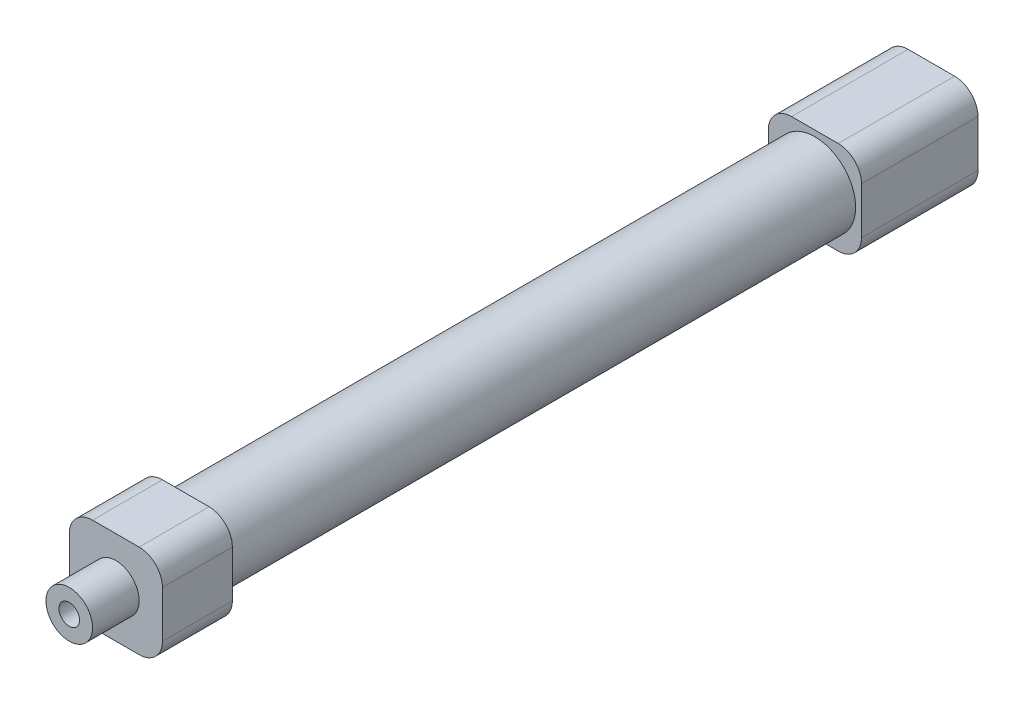
ISO-10303-21;
HEADER;
FILE_DESCRIPTION(('STEP AP214'),'2;1');
FILE_NAME('part.step','',(''),(''),'','','');
FILE_SCHEMA(('AUTOMOTIVE_DESIGN { 1 0 10303 214 1 1 1 1 }'));
ENDSEC;
DATA;
#1=APPLICATION_CONTEXT('core data for automotive mechanical design processes');
#2=APPLICATION_PROTOCOL_DEFINITION('international standard','automotive_design',2000,#1);
#3=PRODUCT_CONTEXT('',#1,'mechanical');
#4=PRODUCT('Part','Part','',(#3));
#5=PRODUCT_RELATED_PRODUCT_CATEGORY('part','',(#4));
#6=PRODUCT_DEFINITION_FORMATION('','',#4);
#7=PRODUCT_DEFINITION_CONTEXT('part definition',#1,'design');
#8=PRODUCT_DEFINITION('design','',#6,#7);
#9=PRODUCT_DEFINITION_SHAPE('','',#8);
#10=(LENGTH_UNIT() NAMED_UNIT(*) SI_UNIT(.MILLI.,.METRE.));
#11=(NAMED_UNIT(*) PLANE_ANGLE_UNIT() SI_UNIT($,.RADIAN.));
#12=(NAMED_UNIT(*) SI_UNIT($,.STERADIAN.) SOLID_ANGLE_UNIT());
#13=UNCERTAINTY_MEASURE_WITH_UNIT(LENGTH_MEASURE(1.E-05),#10,'distance_accuracy_value','');
#14=(GEOMETRIC_REPRESENTATION_CONTEXT(3) GLOBAL_UNCERTAINTY_ASSIGNED_CONTEXT((#13)) GLOBAL_UNIT_ASSIGNED_CONTEXT((#10,
#11,#12)) REPRESENTATION_CONTEXT('',''));
#15=CARTESIAN_POINT('',(0.,0.,0.));
#16=DIRECTION('',(0.,0.,1.));
#17=DIRECTION('',(1.,0.,0.));
#18=AXIS2_PLACEMENT_3D('',#15,#16,#17);
#19=CARTESIAN_POINT('',(0.,0.,175.));
#20=DIRECTION('',(0.,0.,-1.));
#21=DIRECTION('',(-1.,0.,0.));
#22=AXIS2_PLACEMENT_3D('',#19,#20,#21);
#23=CYLINDRICAL_SURFACE('',#22,8.75);
#24=CARTESIAN_POINT('',(0.,0.,25.));
#25=DIRECTION('',(0.,0.,-1.));
#26=DIRECTION('',(-1.,0.,0.));
#27=AXIS2_PLACEMENT_3D('',#24,#25,#26);
#28=CIRCLE('',#27,8.75);
#29=CARTESIAN_POINT('',(-8.75,0.,25.));
#30=VERTEX_POINT('',#29);
#31=EDGE_CURVE('E196',#30,#30,#28,.T.);
#32=ORIENTED_EDGE('',*,*,#31,.F.);
#33=EDGE_LOOP('',(#32));
#34=FACE_BOUND('',#33,.T.);
#35=CARTESIAN_POINT('',(0.,0.,160.));
#36=DIRECTION('',(0.,0.,1.));
#37=DIRECTION('',(1.,0.,0.));
#38=AXIS2_PLACEMENT_3D('',#35,#36,#37);
#39=CIRCLE('',#38,8.75);
#40=CARTESIAN_POINT('',(8.75,0.,160.));
#41=VERTEX_POINT('',#40);
#42=EDGE_CURVE('E190',#41,#41,#39,.T.);
#43=ORIENTED_EDGE('',*,*,#42,.F.);
#44=EDGE_LOOP('',(#43));
#45=FACE_BOUND('',#44,.T.);
#46=ADVANCED_FACE('F45',(#34,#45),#23,.T.);
#47=CARTESIAN_POINT('',(9.99999999999999,-10.,25.));
#48=DIRECTION('',(-1.,0.,0.));
#49=DIRECTION('',(0.,0.,1.));
#50=AXIS2_PLACEMENT_3D('',#47,#48,#49);
#51=PLANE('',#50);
#52=DIRECTION('',(0.,1.,0.));
#53=VECTOR('',#52,1.);
#54=CARTESIAN_POINT('',(9.99999999999999,-10.,25.));
#55=LINE('',#54,#53);
#56=CARTESIAN_POINT('',(9.99999999999999,-5.,25.));
#57=VERTEX_POINT('',#56);
#58=CARTESIAN_POINT('',(9.99999999999999,5.,25.));
#59=VERTEX_POINT('',#58);
#60=EDGE_CURVE('E314',#57,#59,#55,.T.);
#61=ORIENTED_EDGE('',*,*,#60,.F.);
#62=DIRECTION('',(0.,0.,-1.));
#63=VECTOR('',#62,1.);
#64=CARTESIAN_POINT('',(9.99999999999999,-5.,25.));
#65=LINE('',#64,#63);
#66=CARTESIAN_POINT('',(9.99999999999999,-5.,0.));
#67=VERTEX_POINT('',#66);
#68=EDGE_CURVE('E243',#57,#67,#65,.T.);
#69=ORIENTED_EDGE('',*,*,#68,.T.);
#70=DIRECTION('',(0.,1.,0.));
#71=VECTOR('',#70,1.);
#72=CARTESIAN_POINT('',(9.99999999999999,-10.,0.));
#73=LINE('',#72,#71);
#74=CARTESIAN_POINT('',(9.99999999999999,5.,0.));
#75=VERTEX_POINT('',#74);
#76=EDGE_CURVE('E302',#67,#75,#73,.T.);
#77=ORIENTED_EDGE('',*,*,#76,.T.);
#78=DIRECTION('',(0.,0.,-1.));
#79=VECTOR('',#78,1.);
#80=CARTESIAN_POINT('',(9.99999999999999,5.,25.));
#81=LINE('',#80,#79);
#82=EDGE_CURVE('E240',#75,#59,#81,.F.);
#83=ORIENTED_EDGE('',*,*,#82,.T.);
#84=EDGE_LOOP('',(#61,#69,#77,#83));
#85=FACE_BOUND('',#84,.T.);
#86=ADVANCED_FACE('F403',(#85),#51,.F.);
#87=CARTESIAN_POINT('',(-10.,10.,25.));
#88=DIRECTION('',(0.,-1.,0.));
#89=DIRECTION('',(0.,0.,-1.));
#90=AXIS2_PLACEMENT_3D('',#87,#88,#89);
#91=PLANE('',#90);
#92=DIRECTION('',(-1.,0.,0.));
#93=VECTOR('',#92,1.);
#94=CARTESIAN_POINT('',(-10.,10.,0.));
#95=LINE('',#94,#93);
#96=CARTESIAN_POINT('',(4.99999999999999,10.,0.));
#97=VERTEX_POINT('',#96);
#98=CARTESIAN_POINT('',(-5.00000000000001,10.,0.));
#99=VERTEX_POINT('',#98);
#100=EDGE_CURVE('E290',#97,#99,#95,.T.);
#101=ORIENTED_EDGE('',*,*,#100,.T.);
#102=DIRECTION('',(0.,0.,-1.));
#103=VECTOR('',#102,1.);
#104=CARTESIAN_POINT('',(-5.00000000000001,10.,25.));
#105=LINE('',#104,#103);
#106=CARTESIAN_POINT('',(-5.00000000000001,10.,25.));
#107=VERTEX_POINT('',#106);
#108=EDGE_CURVE('E11',#99,#107,#105,.F.);
#109=ORIENTED_EDGE('',*,*,#108,.T.);
#110=DIRECTION('',(-1.,0.,0.));
#111=VECTOR('',#110,1.);
#112=CARTESIAN_POINT('',(-10.,10.,25.));
#113=LINE('',#112,#111);
#114=CARTESIAN_POINT('',(4.99999999999999,10.,25.));
#115=VERTEX_POINT('',#114);
#116=EDGE_CURVE('E292',#115,#107,#113,.T.);
#117=ORIENTED_EDGE('',*,*,#116,.F.);
#118=DIRECTION('',(0.,0.,-1.));
#119=VECTOR('',#118,1.);
#120=CARTESIAN_POINT('',(4.99999999999999,10.,25.));
#121=LINE('',#120,#119);
#122=EDGE_CURVE('E54',#115,#97,#121,.T.);
#123=ORIENTED_EDGE('',*,*,#122,.T.);
#124=EDGE_LOOP('',(#101,#109,#117,#123));
#125=FACE_BOUND('',#124,.T.);
#126=ADVANCED_FACE('F289',(#125),#91,.F.);
#127=CARTESIAN_POINT('',(-10.,-10.,25.));
#128=DIRECTION('',(1.,0.,0.));
#129=DIRECTION('',(0.,0.,-1.));
#130=AXIS2_PLACEMENT_3D('',#127,#128,#129);
#131=PLANE('',#130);
#132=DIRECTION('',(0.,-1.,0.));
#133=VECTOR('',#132,1.);
#134=CARTESIAN_POINT('',(-10.,-10.,0.));
#135=LINE('',#134,#133);
#136=CARTESIAN_POINT('',(-10.,5.,0.));
#137=VERTEX_POINT('',#136);
#138=CARTESIAN_POINT('',(-10.,-5.,0.));
#139=VERTEX_POINT('',#138);
#140=EDGE_CURVE('E301',#137,#139,#135,.T.);
#141=ORIENTED_EDGE('',*,*,#140,.T.);
#142=DIRECTION('',(0.,0.,-1.));
#143=VECTOR('',#142,1.);
#144=CARTESIAN_POINT('',(-10.,-5.,25.));
#145=LINE('',#144,#143);
#146=CARTESIAN_POINT('',(-10.,-5.,25.));
#147=VERTEX_POINT('',#146);
#148=EDGE_CURVE('E61',#139,#147,#145,.F.);
#149=ORIENTED_EDGE('',*,*,#148,.T.);
#150=DIRECTION('',(0.,-1.,0.));
#151=VECTOR('',#150,1.);
#152=CARTESIAN_POINT('',(-10.,-10.,25.));
#153=LINE('',#152,#151);
#154=CARTESIAN_POINT('',(-10.,5.,25.));
#155=VERTEX_POINT('',#154);
#156=EDGE_CURVE('E325',#155,#147,#153,.T.);
#157=ORIENTED_EDGE('',*,*,#156,.F.);
#158=DIRECTION('',(0.,0.,-1.));
#159=VECTOR('',#158,1.);
#160=CARTESIAN_POINT('',(-10.,5.,25.));
#161=LINE('',#160,#159);
#162=EDGE_CURVE('E277',#155,#137,#161,.T.);
#163=ORIENTED_EDGE('',*,*,#162,.T.);
#164=EDGE_LOOP('',(#141,#149,#157,#163));
#165=FACE_BOUND('',#164,.T.);
#166=ADVANCED_FACE('F446',(#165),#131,.F.);
#167=CARTESIAN_POINT('',(-10.,-10.,25.));
#168=DIRECTION('',(0.,1.,0.));
#169=DIRECTION('',(0.,0.,1.));
#170=AXIS2_PLACEMENT_3D('',#167,#168,#169);
#171=PLANE('',#170);
#172=DIRECTION('',(1.,0.,0.));
#173=VECTOR('',#172,1.);
#174=CARTESIAN_POINT('',(-10.,-10.,0.));
#175=LINE('',#174,#173);
#176=CARTESIAN_POINT('',(-5.00000000000001,-10.,0.));
#177=VERTEX_POINT('',#176);
#178=CARTESIAN_POINT('',(4.99999999999999,-10.,0.));
#179=VERTEX_POINT('',#178);
#180=EDGE_CURVE('E306',#177,#179,#175,.T.);
#181=ORIENTED_EDGE('',*,*,#180,.T.);
#182=DIRECTION('',(0.,0.,-1.));
#183=VECTOR('',#182,1.);
#184=CARTESIAN_POINT('',(4.99999999999999,-10.,25.));
#185=LINE('',#184,#183);
#186=CARTESIAN_POINT('',(4.99999999999999,-10.,25.));
#187=VERTEX_POINT('',#186);
#188=EDGE_CURVE('E263',#179,#187,#185,.F.);
#189=ORIENTED_EDGE('',*,*,#188,.T.);
#190=DIRECTION('',(1.,0.,0.));
#191=VECTOR('',#190,1.);
#192=CARTESIAN_POINT('',(-10.,-10.,25.));
#193=LINE('',#192,#191);
#194=CARTESIAN_POINT('',(-5.00000000000001,-10.,25.));
#195=VERTEX_POINT('',#194);
#196=EDGE_CURVE('E320',#195,#187,#193,.T.);
#197=ORIENTED_EDGE('',*,*,#196,.F.);
#198=DIRECTION('',(0.,0.,-1.));
#199=VECTOR('',#198,1.);
#200=CARTESIAN_POINT('',(-5.00000000000001,-10.,25.));
#201=LINE('',#200,#199);
#202=EDGE_CURVE('E259',#195,#177,#201,.T.);
#203=ORIENTED_EDGE('',*,*,#202,.T.);
#204=EDGE_LOOP('',(#181,#189,#197,#203));
#205=FACE_BOUND('',#204,.T.);
#206=ADVANCED_FACE('F451',(#205),#171,.F.);
#207=CARTESIAN_POINT('',(0.,0.,25.));
#208=DIRECTION('',(0.,0.,-1.));
#209=DIRECTION('',(-1.,0.,0.));
#210=AXIS2_PLACEMENT_3D('',#207,#208,#209);
#211=PLANE('',#210);
#212=ORIENTED_EDGE('',*,*,#31,.T.);
#213=EDGE_LOOP('',(#212));
#214=FACE_BOUND('',#213,.T.);
#215=ORIENTED_EDGE('',*,*,#196,.T.);
#216=CARTESIAN_POINT('',(4.99999999999999,-5.,25.));
#217=DIRECTION('',(0.,0.,-1.));
#218=DIRECTION('',(-1.,0.,0.));
#219=AXIS2_PLACEMENT_3D('',#216,#217,#218);
#220=CIRCLE('',#219,5.);
#221=EDGE_CURVE('E274',#187,#57,#220,.F.);
#222=ORIENTED_EDGE('',*,*,#221,.T.);
#223=ORIENTED_EDGE('',*,*,#60,.T.);
#224=CARTESIAN_POINT('',(4.99999999999999,5.,25.));
#225=DIRECTION('',(0.,0.,-1.));
#226=DIRECTION('',(-1.,0.,0.));
#227=AXIS2_PLACEMENT_3D('',#224,#225,#226);
#228=CIRCLE('',#227,5.);
#229=EDGE_CURVE('E266',#59,#115,#228,.F.);
#230=ORIENTED_EDGE('',*,*,#229,.T.);
#231=ORIENTED_EDGE('',*,*,#116,.T.);
#232=CARTESIAN_POINT('',(-5.00000000000001,5.,25.));
#233=DIRECTION('',(0.,0.,-1.));
#234=DIRECTION('',(-1.,0.,0.));
#235=AXIS2_PLACEMENT_3D('',#232,#233,#234);
#236=CIRCLE('',#235,5.);
#237=EDGE_CURVE('E68',#107,#155,#236,.F.);
#238=ORIENTED_EDGE('',*,*,#237,.T.);
#239=ORIENTED_EDGE('',*,*,#156,.T.);
#240=CARTESIAN_POINT('',(-5.00000000000001,-5.,25.));
#241=DIRECTION('',(0.,0.,-1.));
#242=DIRECTION('',(-1.,0.,0.));
#243=AXIS2_PLACEMENT_3D('',#240,#241,#242);
#244=CIRCLE('',#243,5.);
#245=EDGE_CURVE('E271',#147,#195,#244,.F.);
#246=ORIENTED_EDGE('',*,*,#245,.T.);
#247=EDGE_LOOP('',(#215,#222,#223,#230,#231,#238,#239,#246));
#248=FACE_BOUND('',#247,.T.);
#249=ADVANCED_FACE('F455',(#214,#248),#211,.F.);
#250=CARTESIAN_POINT('',(0.,0.,0.));
#251=DIRECTION('',(0.,0.,1.));
#252=DIRECTION('',(1.,0.,0.));
#253=AXIS2_PLACEMENT_3D('',#250,#251,#252);
#254=PLANE('',#253);
#255=ORIENTED_EDGE('',*,*,#76,.F.);
#256=CARTESIAN_POINT('',(4.99999999999999,-5.,0.));
#257=DIRECTION('',(0.,0.,1.));
#258=DIRECTION('',(1.,0.,0.));
#259=AXIS2_PLACEMENT_3D('',#256,#257,#258);
#260=CIRCLE('',#259,5.);
#261=EDGE_CURVE('E256',#67,#179,#260,.F.);
#262=ORIENTED_EDGE('',*,*,#261,.T.);
#263=ORIENTED_EDGE('',*,*,#180,.F.);
#264=CARTESIAN_POINT('',(-5.00000000000001,-5.,0.));
#265=DIRECTION('',(0.,0.,1.));
#266=DIRECTION('',(1.,0.,0.));
#267=AXIS2_PLACEMENT_3D('',#264,#265,#266);
#268=CIRCLE('',#267,5.);
#269=EDGE_CURVE('E253',#177,#139,#268,.F.);
#270=ORIENTED_EDGE('',*,*,#269,.T.);
#271=ORIENTED_EDGE('',*,*,#140,.F.);
#272=CARTESIAN_POINT('',(-5.00000000000001,5.,0.));
#273=DIRECTION('',(0.,0.,1.));
#274=DIRECTION('',(1.,0.,0.));
#275=AXIS2_PLACEMENT_3D('',#272,#273,#274);
#276=CIRCLE('',#275,5.);
#277=EDGE_CURVE('E250',#137,#99,#276,.F.);
#278=ORIENTED_EDGE('',*,*,#277,.T.);
#279=ORIENTED_EDGE('',*,*,#100,.F.);
#280=CARTESIAN_POINT('',(4.99999999999999,5.,0.));
#281=DIRECTION('',(0.,0.,1.));
#282=DIRECTION('',(1.,0.,0.));
#283=AXIS2_PLACEMENT_3D('',#280,#281,#282);
#284=CIRCLE('',#283,5.);
#285=EDGE_CURVE('E247',#97,#75,#284,.F.);
#286=ORIENTED_EDGE('',*,*,#285,.T.);
#287=EDGE_LOOP('',(#255,#262,#263,#270,#271,#278,#279,#286));
#288=FACE_BOUND('',#287,.T.);
#289=ADVANCED_FACE('F297',(#288),#254,.F.);
#290=CARTESIAN_POINT('',(-10.,-10.,160.));
#291=DIRECTION('',(0.,-1.,0.));
#292=DIRECTION('',(0.,0.,-1.));
#293=AXIS2_PLACEMENT_3D('',#290,#291,#292);
#294=PLANE('',#293);
#295=DIRECTION('',(1.,0.,0.));
#296=VECTOR('',#295,1.);
#297=CARTESIAN_POINT('',(-10.,-10.,160.));
#298=LINE('',#297,#296);
#299=CARTESIAN_POINT('',(-5.00000000000001,-10.,160.));
#300=VERTEX_POINT('',#299);
#301=CARTESIAN_POINT('',(5.,-10.,160.));
#302=VERTEX_POINT('',#301);
#303=EDGE_CURVE('E338',#300,#302,#298,.T.);
#304=ORIENTED_EDGE('',*,*,#303,.T.);
#305=DIRECTION('',(0.,0.,1.));
#306=VECTOR('',#305,1.);
#307=CARTESIAN_POINT('',(5.,-10.,160.));
#308=LINE('',#307,#306);
#309=CARTESIAN_POINT('',(5.,-10.,175.));
#310=VERTEX_POINT('',#309);
#311=EDGE_CURVE('E181',#302,#310,#308,.T.);
#312=ORIENTED_EDGE('',*,*,#311,.T.);
#313=DIRECTION('',(1.,0.,0.));
#314=VECTOR('',#313,1.);
#315=CARTESIAN_POINT('',(-10.,-10.,175.));
#316=LINE('',#315,#314);
#317=CARTESIAN_POINT('',(-5.00000000000001,-10.,175.));
#318=VERTEX_POINT('',#317);
#319=EDGE_CURVE('E163',#318,#310,#316,.T.);
#320=ORIENTED_EDGE('',*,*,#319,.F.);
#321=DIRECTION('',(0.,0.,1.));
#322=VECTOR('',#321,1.);
#323=CARTESIAN_POINT('',(-5.00000000000001,-10.,160.));
#324=LINE('',#323,#322);
#325=EDGE_CURVE('E178',#318,#300,#324,.F.);
#326=ORIENTED_EDGE('',*,*,#325,.T.);
#327=EDGE_LOOP('',(#304,#312,#320,#326));
#328=FACE_BOUND('',#327,.T.);
#329=ADVANCED_FACE('F177',(#328),#294,.T.);
#330=CARTESIAN_POINT('',(-10.,10.,160.));
#331=DIRECTION('',(-1.,0.,0.));
#332=DIRECTION('',(0.,0.,1.));
#333=AXIS2_PLACEMENT_3D('',#330,#331,#332);
#334=PLANE('',#333);
#335=DIRECTION('',(0.,-1.,0.));
#336=VECTOR('',#335,1.);
#337=CARTESIAN_POINT('',(-10.,10.,160.));
#338=LINE('',#337,#336);
#339=CARTESIAN_POINT('',(-10.,5.,160.));
#340=VERTEX_POINT('',#339);
#341=CARTESIAN_POINT('',(-10.,-5.,160.));
#342=VERTEX_POINT('',#341);
#343=EDGE_CURVE('E346',#340,#342,#338,.T.);
#344=ORIENTED_EDGE('',*,*,#343,.T.);
#345=DIRECTION('',(0.,0.,1.));
#346=VECTOR('',#345,1.);
#347=CARTESIAN_POINT('',(-10.,-5.,160.));
#348=LINE('',#347,#346);
#349=CARTESIAN_POINT('',(-10.,-5.,175.));
#350=VERTEX_POINT('',#349);
#351=EDGE_CURVE('E237',#342,#350,#348,.T.);
#352=ORIENTED_EDGE('',*,*,#351,.T.);
#353=DIRECTION('',(0.,-1.,0.));
#354=VECTOR('',#353,1.);
#355=CARTESIAN_POINT('',(-10.,10.,175.));
#356=LINE('',#355,#354);
#357=CARTESIAN_POINT('',(-10.,5.,175.));
#358=VERTEX_POINT('',#357);
#359=EDGE_CURVE('E165',#358,#350,#356,.T.);
#360=ORIENTED_EDGE('',*,*,#359,.F.);
#361=DIRECTION('',(0.,0.,1.));
#362=VECTOR('',#361,1.);
#363=CARTESIAN_POINT('',(-10.,5.,160.));
#364=LINE('',#363,#362);
#365=EDGE_CURVE('E234',#358,#340,#364,.F.);
#366=ORIENTED_EDGE('',*,*,#365,.T.);
#367=EDGE_LOOP('',(#344,#352,#360,#366));
#368=FACE_BOUND('',#367,.T.);
#369=ADVANCED_FACE('F597',(#368),#334,.T.);
#370=CARTESIAN_POINT('',(9.99999999999999,10.,160.));
#371=DIRECTION('',(0.,1.,0.));
#372=DIRECTION('',(0.,0.,1.));
#373=AXIS2_PLACEMENT_3D('',#370,#371,#372);
#374=PLANE('',#373);
#375=DIRECTION('',(-1.,0.,0.));
#376=VECTOR('',#375,1.);
#377=CARTESIAN_POINT('',(9.99999999999999,10.,175.));
#378=LINE('',#377,#376);
#379=CARTESIAN_POINT('',(5.,10.,175.));
#380=VERTEX_POINT('',#379);
#381=CARTESIAN_POINT('',(-5.00000000000001,10.,175.));
#382=VERTEX_POINT('',#381);
#383=EDGE_CURVE('E339',#380,#382,#378,.T.);
#384=ORIENTED_EDGE('',*,*,#383,.F.);
#385=DIRECTION('',(0.,0.,1.));
#386=VECTOR('',#385,1.);
#387=CARTESIAN_POINT('',(5.,10.,160.));
#388=LINE('',#387,#386);
#389=CARTESIAN_POINT('',(5.,10.,160.));
#390=VERTEX_POINT('',#389);
#391=EDGE_CURVE('E231',#380,#390,#388,.F.);
#392=ORIENTED_EDGE('',*,*,#391,.T.);
#393=DIRECTION('',(-1.,0.,0.));
#394=VECTOR('',#393,1.);
#395=CARTESIAN_POINT('',(9.99999999999999,10.,160.));
#396=LINE('',#395,#394);
#397=CARTESIAN_POINT('',(-5.00000000000001,10.,160.));
#398=VERTEX_POINT('',#397);
#399=EDGE_CURVE('E350',#390,#398,#396,.T.);
#400=ORIENTED_EDGE('',*,*,#399,.T.);
#401=DIRECTION('',(0.,0.,1.));
#402=VECTOR('',#401,1.);
#403=CARTESIAN_POINT('',(-5.00000000000001,10.,160.));
#404=LINE('',#403,#402);
#405=EDGE_CURVE('E227',#398,#382,#404,.T.);
#406=ORIENTED_EDGE('',*,*,#405,.T.);
#407=EDGE_LOOP('',(#384,#392,#400,#406));
#408=FACE_BOUND('',#407,.T.);
#409=ADVANCED_FACE('F587',(#408),#374,.T.);
#410=CARTESIAN_POINT('',(9.99999999999999,-10.,160.));
#411=DIRECTION('',(1.,0.,0.));
#412=DIRECTION('',(0.,0.,-1.));
#413=AXIS2_PLACEMENT_3D('',#410,#411,#412);
#414=PLANE('',#413);
#415=DIRECTION('',(0.,1.,0.));
#416=VECTOR('',#415,1.);
#417=CARTESIAN_POINT('',(9.99999999999999,-10.,175.));
#418=LINE('',#417,#416);
#419=CARTESIAN_POINT('',(9.99999999999999,-5.,175.));
#420=VERTEX_POINT('',#419);
#421=CARTESIAN_POINT('',(9.99999999999999,5.,175.));
#422=VERTEX_POINT('',#421);
#423=EDGE_CURVE('E183',#420,#422,#418,.T.);
#424=ORIENTED_EDGE('',*,*,#423,.F.);
#425=DIRECTION('',(0.,0.,1.));
#426=VECTOR('',#425,1.);
#427=CARTESIAN_POINT('',(9.99999999999999,-5.,160.));
#428=LINE('',#427,#426);
#429=CARTESIAN_POINT('',(9.99999999999999,-5.,160.));
#430=VERTEX_POINT('',#429);
#431=EDGE_CURVE('E213',#420,#430,#428,.F.);
#432=ORIENTED_EDGE('',*,*,#431,.T.);
#433=DIRECTION('',(0.,1.,0.));
#434=VECTOR('',#433,1.);
#435=CARTESIAN_POINT('',(9.99999999999999,-10.,160.));
#436=LINE('',#435,#434);
#437=CARTESIAN_POINT('',(9.99999999999999,5.,160.));
#438=VERTEX_POINT('',#437);
#439=EDGE_CURVE('E354',#430,#438,#436,.T.);
#440=ORIENTED_EDGE('',*,*,#439,.T.);
#441=DIRECTION('',(0.,0.,1.));
#442=VECTOR('',#441,1.);
#443=CARTESIAN_POINT('',(9.99999999999999,5.,160.));
#444=LINE('',#443,#442);
#445=EDGE_CURVE('E209',#438,#422,#444,.T.);
#446=ORIENTED_EDGE('',*,*,#445,.T.);
#447=EDGE_LOOP('',(#424,#432,#440,#446));
#448=FACE_BOUND('',#447,.T.);
#449=ADVANCED_FACE('F578',(#448),#414,.T.);
#450=CARTESIAN_POINT('',(0.,0.,160.));
#451=DIRECTION('',(0.,0.,1.));
#452=DIRECTION('',(1.,0.,0.));
#453=AXIS2_PLACEMENT_3D('',#450,#451,#452);
#454=PLANE('',#453);
#455=ORIENTED_EDGE('',*,*,#42,.T.);
#456=EDGE_LOOP('',(#455));
#457=FACE_BOUND('',#456,.T.);
#458=ORIENTED_EDGE('',*,*,#439,.F.);
#459=CARTESIAN_POINT('',(5.,-5.,160.));
#460=DIRECTION('',(0.,0.,1.));
#461=DIRECTION('',(1.,0.,0.));
#462=AXIS2_PLACEMENT_3D('',#459,#460,#461);
#463=CIRCLE('',#462,5.);
#464=EDGE_CURVE('E224',#430,#302,#463,.F.);
#465=ORIENTED_EDGE('',*,*,#464,.T.);
#466=ORIENTED_EDGE('',*,*,#303,.F.);
#467=CARTESIAN_POINT('',(-5.00000000000001,-5.,160.));
#468=DIRECTION('',(0.,0.,1.));
#469=DIRECTION('',(1.,0.,0.));
#470=AXIS2_PLACEMENT_3D('',#467,#468,#469);
#471=CIRCLE('',#470,5.);
#472=EDGE_CURVE('E188',#300,#342,#471,.F.);
#473=ORIENTED_EDGE('',*,*,#472,.T.);
#474=ORIENTED_EDGE('',*,*,#343,.F.);
#475=CARTESIAN_POINT('',(-5.00000000000001,5.,160.));
#476=DIRECTION('',(0.,0.,1.));
#477=DIRECTION('',(1.,0.,0.));
#478=AXIS2_PLACEMENT_3D('',#475,#476,#477);
#479=CIRCLE('',#478,5.);
#480=EDGE_CURVE('E216',#340,#398,#479,.F.);
#481=ORIENTED_EDGE('',*,*,#480,.T.);
#482=ORIENTED_EDGE('',*,*,#399,.F.);
#483=CARTESIAN_POINT('',(5.,5.,160.));
#484=DIRECTION('',(0.,0.,1.));
#485=DIRECTION('',(1.,0.,0.));
#486=AXIS2_PLACEMENT_3D('',#483,#484,#485);
#487=CIRCLE('',#486,5.);
#488=EDGE_CURVE('E221',#390,#438,#487,.F.);
#489=ORIENTED_EDGE('',*,*,#488,.T.);
#490=EDGE_LOOP('',(#458,#465,#466,#473,#474,#481,#482,#489));
#491=FACE_BOUND('',#490,.T.);
#492=ADVANCED_FACE('F561',(#457,#491),#454,.F.);
#493=CARTESIAN_POINT('',(0.,0.,175.));
#494=DIRECTION('',(0.,0.,1.));
#495=DIRECTION('',(1.,0.,0.));
#496=AXIS2_PLACEMENT_3D('',#493,#494,#495);
#497=PLANE('',#496);
#498=CARTESIAN_POINT('',(0.,0.,175.));
#499=DIRECTION('',(0.,0.,1.));
#500=DIRECTION('',(1.,0.,0.));
#501=AXIS2_PLACEMENT_3D('',#498,#499,#500);
#502=CIRCLE('',#501,5.);
#503=CARTESIAN_POINT('',(5.,0.,175.));
#504=VERTEX_POINT('',#503);
#505=EDGE_CURVE('E368',#504,#504,#502,.T.);
#506=ORIENTED_EDGE('',*,*,#505,.F.);
#507=EDGE_LOOP('',(#506));
#508=FACE_BOUND('',#507,.T.);
#509=ORIENTED_EDGE('',*,*,#319,.T.);
#510=CARTESIAN_POINT('',(5.,-5.,175.));
#511=DIRECTION('',(0.,0.,1.));
#512=DIRECTION('',(1.,0.,0.));
#513=AXIS2_PLACEMENT_3D('',#510,#511,#512);
#514=CIRCLE('',#513,5.);
#515=EDGE_CURVE('E206',#310,#420,#514,.T.);
#516=ORIENTED_EDGE('',*,*,#515,.T.);
#517=ORIENTED_EDGE('',*,*,#423,.T.);
#518=CARTESIAN_POINT('',(5.,5.,175.));
#519=DIRECTION('',(0.,0.,1.));
#520=DIRECTION('',(1.,0.,0.));
#521=AXIS2_PLACEMENT_3D('',#518,#519,#520);
#522=CIRCLE('',#521,5.);
#523=EDGE_CURVE('E171',#422,#380,#522,.T.);
#524=ORIENTED_EDGE('',*,*,#523,.T.);
#525=ORIENTED_EDGE('',*,*,#383,.T.);
#526=CARTESIAN_POINT('',(-5.00000000000001,5.,175.));
#527=DIRECTION('',(0.,0.,1.));
#528=DIRECTION('',(1.,0.,0.));
#529=AXIS2_PLACEMENT_3D('',#526,#527,#528);
#530=CIRCLE('',#529,5.);
#531=EDGE_CURVE('E172',#382,#358,#530,.T.);
#532=ORIENTED_EDGE('',*,*,#531,.T.);
#533=ORIENTED_EDGE('',*,*,#359,.T.);
#534=CARTESIAN_POINT('',(-5.00000000000001,-5.,175.));
#535=DIRECTION('',(0.,0.,1.));
#536=DIRECTION('',(1.,0.,0.));
#537=AXIS2_PLACEMENT_3D('',#534,#535,#536);
#538=CIRCLE('',#537,5.);
#539=EDGE_CURVE('E160',#350,#318,#538,.T.);
#540=ORIENTED_EDGE('',*,*,#539,.T.);
#541=EDGE_LOOP('',(#509,#516,#517,#524,#525,#532,#533,#540));
#542=FACE_BOUND('',#541,.T.);
#543=ADVANCED_FACE('F162',(#508,#542),#497,.T.);
#544=CARTESIAN_POINT('',(5.,-5.,160.));
#545=DIRECTION('',(0.,0.,1.));
#546=DIRECTION('',(1.,0.,0.));
#547=AXIS2_PLACEMENT_3D('',#544,#545,#546);
#548=CYLINDRICAL_SURFACE('',#547,5.);
#549=ORIENTED_EDGE('',*,*,#464,.F.);
#550=ORIENTED_EDGE('',*,*,#431,.F.);
#551=ORIENTED_EDGE('',*,*,#515,.F.);
#552=ORIENTED_EDGE('',*,*,#311,.F.);
#553=EDGE_LOOP('',(#549,#550,#551,#552));
#554=FACE_BOUND('',#553,.T.);
#555=ADVANCED_FACE('F418',(#554),#548,.T.);
#556=CARTESIAN_POINT('',(5.,5.,160.));
#557=DIRECTION('',(0.,0.,1.));
#558=DIRECTION('',(1.,0.,0.));
#559=AXIS2_PLACEMENT_3D('',#556,#557,#558);
#560=CYLINDRICAL_SURFACE('',#559,5.);
#561=ORIENTED_EDGE('',*,*,#488,.F.);
#562=ORIENTED_EDGE('',*,*,#391,.F.);
#563=ORIENTED_EDGE('',*,*,#523,.F.);
#564=ORIENTED_EDGE('',*,*,#445,.F.);
#565=EDGE_LOOP('',(#561,#562,#563,#564));
#566=FACE_BOUND('',#565,.T.);
#567=ADVANCED_FACE('F421',(#566),#560,.T.);
#568=CARTESIAN_POINT('',(-5.00000000000001,-5.,160.));
#569=DIRECTION('',(0.,0.,1.));
#570=DIRECTION('',(1.,0.,0.));
#571=AXIS2_PLACEMENT_3D('',#568,#569,#570);
#572=CYLINDRICAL_SURFACE('',#571,5.);
#573=ORIENTED_EDGE('',*,*,#472,.F.);
#574=ORIENTED_EDGE('',*,*,#325,.F.);
#575=ORIENTED_EDGE('',*,*,#539,.F.);
#576=ORIENTED_EDGE('',*,*,#351,.F.);
#577=EDGE_LOOP('',(#573,#574,#575,#576));
#578=FACE_BOUND('',#577,.T.);
#579=ADVANCED_FACE('F187',(#578),#572,.T.);
#580=CARTESIAN_POINT('',(-5.00000000000001,5.,160.));
#581=DIRECTION('',(0.,0.,1.));
#582=DIRECTION('',(1.,0.,0.));
#583=AXIS2_PLACEMENT_3D('',#580,#581,#582);
#584=CYLINDRICAL_SURFACE('',#583,5.);
#585=ORIENTED_EDGE('',*,*,#480,.F.);
#586=ORIENTED_EDGE('',*,*,#365,.F.);
#587=ORIENTED_EDGE('',*,*,#531,.F.);
#588=ORIENTED_EDGE('',*,*,#405,.F.);
#589=EDGE_LOOP('',(#585,#586,#587,#588));
#590=FACE_BOUND('',#589,.T.);
#591=ADVANCED_FACE('F428',(#590),#584,.T.);
#592=CARTESIAN_POINT('',(4.99999999999999,-5.,25.));
#593=DIRECTION('',(0.,0.,-1.));
#594=DIRECTION('',(-1.,0.,0.));
#595=AXIS2_PLACEMENT_3D('',#592,#593,#594);
#596=CYLINDRICAL_SURFACE('',#595,5.);
#597=ORIENTED_EDGE('',*,*,#221,.F.);
#598=ORIENTED_EDGE('',*,*,#188,.F.);
#599=ORIENTED_EDGE('',*,*,#261,.F.);
#600=ORIENTED_EDGE('',*,*,#68,.F.);
#601=EDGE_LOOP('',(#597,#598,#599,#600));
#602=FACE_BOUND('',#601,.T.);
#603=ADVANCED_FACE('F431',(#602),#596,.T.);
#604=CARTESIAN_POINT('',(-5.00000000000001,-5.,25.));
#605=DIRECTION('',(0.,0.,-1.));
#606=DIRECTION('',(-1.,0.,0.));
#607=AXIS2_PLACEMENT_3D('',#604,#605,#606);
#608=CYLINDRICAL_SURFACE('',#607,5.);
#609=ORIENTED_EDGE('',*,*,#245,.F.);
#610=ORIENTED_EDGE('',*,*,#148,.F.);
#611=ORIENTED_EDGE('',*,*,#269,.F.);
#612=ORIENTED_EDGE('',*,*,#202,.F.);
#613=EDGE_LOOP('',(#609,#610,#611,#612));
#614=FACE_BOUND('',#613,.T.);
#615=ADVANCED_FACE('F435',(#614),#608,.T.);
#616=CARTESIAN_POINT('',(-5.00000000000001,5.,25.));
#617=DIRECTION('',(0.,0.,-1.));
#618=DIRECTION('',(-1.,0.,0.));
#619=AXIS2_PLACEMENT_3D('',#616,#617,#618);
#620=CYLINDRICAL_SURFACE('',#619,5.);
#621=ORIENTED_EDGE('',*,*,#237,.F.);
#622=ORIENTED_EDGE('',*,*,#108,.F.);
#623=ORIENTED_EDGE('',*,*,#277,.F.);
#624=ORIENTED_EDGE('',*,*,#162,.F.);
#625=EDGE_LOOP('',(#621,#622,#623,#624));
#626=FACE_BOUND('',#625,.T.);
#627=ADVANCED_FACE('F438',(#626),#620,.T.);
#628=CARTESIAN_POINT('',(4.99999999999999,5.,25.));
#629=DIRECTION('',(0.,0.,-1.));
#630=DIRECTION('',(-1.,0.,0.));
#631=AXIS2_PLACEMENT_3D('',#628,#629,#630);
#632=CYLINDRICAL_SURFACE('',#631,5.);
#633=ORIENTED_EDGE('',*,*,#229,.F.);
#634=ORIENTED_EDGE('',*,*,#82,.F.);
#635=ORIENTED_EDGE('',*,*,#285,.F.);
#636=ORIENTED_EDGE('',*,*,#122,.F.);
#637=EDGE_LOOP('',(#633,#634,#635,#636));
#638=FACE_BOUND('',#637,.T.);
#639=ADVANCED_FACE('F47',(#638),#632,.T.);
#640=CARTESIAN_POINT('',(0.,0.,175.));
#641=DIRECTION('',(0.,0.,1.));
#642=DIRECTION('',(1.,0.,0.));
#643=AXIS2_PLACEMENT_3D('',#640,#641,#642);
#644=PLANE('',#643);
#645=CARTESIAN_POINT('',(0.,0.,175.));
#646=DIRECTION('',(0.,0.,1.));
#647=DIRECTION('',(1.,0.,0.));
#648=AXIS2_PLACEMENT_3D('',#645,#646,#647);
#649=CIRCLE('',#648,2.21238726527861);
#650=CARTESIAN_POINT('',(2.21238726527861,0.,175.));
#651=VERTEX_POINT('',#650);
#652=EDGE_CURVE('E376',#651,#651,#649,.T.);
#653=ORIENTED_EDGE('',*,*,#652,.T.);
#654=EDGE_LOOP('',(#653));
#655=FACE_BOUND('',#654,.T.);
#656=CARTESIAN_POINT('',(0.,0.,175.));
#657=DIRECTION('',(0.,0.,1.));
#658=DIRECTION('',(1.,0.,0.));
#659=AXIS2_PLACEMENT_3D('',#656,#657,#658);
#660=CIRCLE('',#659,4.);
#661=CARTESIAN_POINT('',(4.,0.,175.));
#662=VERTEX_POINT('',#661);
#663=EDGE_CURVE('E363',#662,#662,#660,.F.);
#664=ORIENTED_EDGE('',*,*,#663,.T.);
#665=EDGE_LOOP('',(#664));
#666=FACE_BOUND('',#665,.T.);
#667=ADVANCED_FACE('F390',(#655,#666),#644,.F.);
#668=CARTESIAN_POINT('',(0.,0.,185.));
#669=DIRECTION('',(0.,0.,1.));
#670=DIRECTION('',(1.,0.,0.));
#671=AXIS2_PLACEMENT_3D('',#668,#669,#670);
#672=PLANE('',#671);
#673=CARTESIAN_POINT('',(0.,0.,185.));
#674=DIRECTION('',(0.,0.,1.));
#675=DIRECTION('',(1.,0.,0.));
#676=AXIS2_PLACEMENT_3D('',#673,#674,#675);
#677=CIRCLE('',#676,5.);
#678=CARTESIAN_POINT('',(5.,0.,185.));
#679=VERTEX_POINT('',#678);
#680=EDGE_CURVE('E367',#679,#679,#677,.T.);
#681=ORIENTED_EDGE('',*,*,#680,.T.);
#682=EDGE_LOOP('',(#681));
#683=FACE_BOUND('',#682,.T.);
#684=CARTESIAN_POINT('',(0.,0.,185.));
#685=DIRECTION('',(0.,0.,1.));
#686=DIRECTION('',(1.,0.,0.));
#687=AXIS2_PLACEMENT_3D('',#684,#685,#686);
#688=CIRCLE('',#687,2.21238726527861);
#689=CARTESIAN_POINT('',(2.21238726527861,0.,185.));
#690=VERTEX_POINT('',#689);
#691=EDGE_CURVE('E372',#690,#690,#688,.T.);
#692=ORIENTED_EDGE('',*,*,#691,.F.);
#693=EDGE_LOOP('',(#692));
#694=FACE_BOUND('',#693,.T.);
#695=ADVANCED_FACE('F387',(#683,#694),#672,.T.);
#696=CARTESIAN_POINT('',(0.,0.,185.));
#697=DIRECTION('',(0.,0.,-1.));
#698=DIRECTION('',(-1.,0.,0.));
#699=AXIS2_PLACEMENT_3D('',#696,#697,#698);
#700=CYLINDRICAL_SURFACE('',#699,5.);
#701=ORIENTED_EDGE('',*,*,#680,.F.);
#702=EDGE_LOOP('',(#701));
#703=FACE_BOUND('',#702,.T.);
#704=ORIENTED_EDGE('',*,*,#505,.T.);
#705=EDGE_LOOP('',(#704));
#706=FACE_BOUND('',#705,.T.);
#707=ADVANCED_FACE('F389',(#703,#706),#700,.T.);
#708=CARTESIAN_POINT('',(0.,0.,185.));
#709=DIRECTION('',(0.,0.,-1.));
#710=DIRECTION('',(-1.,0.,0.));
#711=AXIS2_PLACEMENT_3D('',#708,#709,#710);
#712=CYLINDRICAL_SURFACE('',#711,2.21238726527861);
#713=ORIENTED_EDGE('',*,*,#691,.T.);
#714=EDGE_LOOP('',(#713));
#715=FACE_BOUND('',#714,.T.);
#716=ORIENTED_EDGE('',*,*,#652,.F.);
#717=EDGE_LOOP('',(#716));
#718=FACE_BOUND('',#717,.T.);
#719=ADVANCED_FACE('F384',(#715,#718),#712,.F.);
#720=CARTESIAN_POINT('',(0.,0.,25.));
#721=DIRECTION('',(0.,0.,-1.));
#722=DIRECTION('',(-1.,0.,0.));
#723=AXIS2_PLACEMENT_3D('',#720,#721,#722);
#724=CIRCLE('',#723,8.);
#725=CARTESIAN_POINT('',(-8.,0.,25.));
#726=VERTEX_POINT('',#725);
#727=EDGE_CURVE('E317',#726,#726,#724,.T.);
#728=ORIENTED_EDGE('',*,*,#727,.F.);
#729=EDGE_LOOP('',(#728));
#730=FACE_BOUND('',#729,.T.);
#731=ADVANCED_FACE('F460',(#730),#211,.F.);
#732=CARTESIAN_POINT('',(0.,0.,175.));
#733=DIRECTION('',(0.,0.,-1.));
#734=DIRECTION('',(-1.,0.,0.));
#735=AXIS2_PLACEMENT_3D('',#732,#733,#734);
#736=CYLINDRICAL_SURFACE('',#735,8.);
#737=ORIENTED_EDGE('',*,*,#727,.T.);
#738=EDGE_LOOP('',(#737));
#739=FACE_BOUND('',#738,.T.);
#740=CARTESIAN_POINT('',(0.,0.,160.));
#741=DIRECTION('',(0.,0.,1.));
#742=DIRECTION('',(1.,0.,0.));
#743=AXIS2_PLACEMENT_3D('',#740,#741,#742);
#744=CIRCLE('',#743,8.);
#745=CARTESIAN_POINT('',(8.,0.,160.));
#746=VERTEX_POINT('',#745);
#747=EDGE_CURVE('E199',#746,#746,#744,.T.);
#748=ORIENTED_EDGE('',*,*,#747,.T.);
#749=EDGE_LOOP('',(#748));
#750=FACE_BOUND('',#749,.T.);
#751=ADVANCED_FACE('F467',(#739,#750),#736,.F.);
#752=CARTESIAN_POINT('',(0.,0.,160.));
#753=DIRECTION('',(0.,0.,1.));
#754=DIRECTION('',(1.,0.,0.));
#755=AXIS2_PLACEMENT_3D('',#752,#753,#754);
#756=CIRCLE('',#755,4.);
#757=CARTESIAN_POINT('',(4.,0.,160.));
#758=VERTEX_POINT('',#757);
#759=EDGE_CURVE('E184',#758,#758,#756,.T.);
#760=ORIENTED_EDGE('',*,*,#759,.T.);
#761=EDGE_LOOP('',(#760));
#762=FACE_BOUND('',#761,.T.);
#763=ORIENTED_EDGE('',*,*,#747,.F.);
#764=EDGE_LOOP('',(#763));
#765=FACE_BOUND('',#764,.T.);
#766=ADVANCED_FACE('F472',(#762,#765),#454,.F.);
#767=CARTESIAN_POINT('',(0.,0.,160.));
#768=DIRECTION('',(0.,0.,1.));
#769=DIRECTION('',(1.,0.,0.));
#770=AXIS2_PLACEMENT_3D('',#767,#768,#769);
#771=CYLINDRICAL_SURFACE('',#770,4.);
#772=CARTESIAN_POINT('',(4.,0.,160.));
#773=CARTESIAN_POINT('',(4.,0.,160.15625));
#774=CARTESIAN_POINT('',(4.,0.,160.3125));
#775=CARTESIAN_POINT('',(4.,0.,160.625));
#776=CARTESIAN_POINT('',(4.,0.,160.78125));
#777=CARTESIAN_POINT('',(4.,0.,161.09375));
#778=CARTESIAN_POINT('',(4.,0.,161.25));
#779=CARTESIAN_POINT('',(4.,0.,161.5625));
#780=CARTESIAN_POINT('',(4.,0.,161.71875));
#781=CARTESIAN_POINT('',(4.,0.,162.03125));
#782=CARTESIAN_POINT('',(4.,0.,162.1875));
#783=CARTESIAN_POINT('',(4.,0.,162.5));
#784=CARTESIAN_POINT('',(4.,0.,162.65625));
#785=CARTESIAN_POINT('',(4.,0.,162.96875));
#786=CARTESIAN_POINT('',(4.,0.,163.125));
#787=CARTESIAN_POINT('',(4.,0.,163.4375));
#788=CARTESIAN_POINT('',(4.,0.,163.59375));
#789=CARTESIAN_POINT('',(4.,0.,163.90625));
#790=CARTESIAN_POINT('',(4.,0.,164.0625));
#791=CARTESIAN_POINT('',(4.,0.,164.375));
#792=CARTESIAN_POINT('',(4.,0.,164.53125));
#793=CARTESIAN_POINT('',(4.,0.,164.84375));
#794=CARTESIAN_POINT('',(4.,0.,165.));
#795=CARTESIAN_POINT('',(4.,0.,165.3125));
#796=CARTESIAN_POINT('',(4.,0.,165.46875));
#797=CARTESIAN_POINT('',(4.,0.,165.78125));
#798=CARTESIAN_POINT('',(4.,0.,165.9375));
#799=CARTESIAN_POINT('',(4.,0.,166.25));
#800=CARTESIAN_POINT('',(4.,0.,166.40625));
#801=CARTESIAN_POINT('',(4.,0.,166.71875));
#802=CARTESIAN_POINT('',(4.,0.,166.875));
#803=CARTESIAN_POINT('',(4.,0.,167.1875));
#804=CARTESIAN_POINT('',(4.,0.,167.34375));
#805=CARTESIAN_POINT('',(4.,0.,167.65625));
#806=CARTESIAN_POINT('',(4.,0.,167.8125));
#807=CARTESIAN_POINT('',(4.,0.,168.125));
#808=CARTESIAN_POINT('',(4.,0.,168.28125));
#809=CARTESIAN_POINT('',(4.,0.,168.59375));
#810=CARTESIAN_POINT('',(4.,0.,168.75));
#811=CARTESIAN_POINT('',(4.,0.,169.0625));
#812=CARTESIAN_POINT('',(4.,0.,169.21875));
#813=CARTESIAN_POINT('',(4.,0.,169.53125));
#814=CARTESIAN_POINT('',(4.,0.,169.6875));
#815=CARTESIAN_POINT('',(4.,0.,170.));
#816=CARTESIAN_POINT('',(4.,0.,170.15625));
#817=CARTESIAN_POINT('',(4.,0.,170.46875));
#818=CARTESIAN_POINT('',(4.,0.,170.625));
#819=CARTESIAN_POINT('',(4.,0.,170.9375));
#820=CARTESIAN_POINT('',(4.,0.,171.09375));
#821=CARTESIAN_POINT('',(4.,0.,171.40625));
#822=CARTESIAN_POINT('',(4.,0.,171.5625));
#823=CARTESIAN_POINT('',(4.,0.,171.875));
#824=CARTESIAN_POINT('',(4.,0.,172.03125));
#825=CARTESIAN_POINT('',(4.,0.,172.34375));
#826=CARTESIAN_POINT('',(4.,0.,172.5));
#827=CARTESIAN_POINT('',(4.,0.,172.8125));
#828=CARTESIAN_POINT('',(4.,0.,172.96875));
#829=CARTESIAN_POINT('',(4.,0.,173.28125));
#830=CARTESIAN_POINT('',(4.,0.,173.4375));
#831=CARTESIAN_POINT('',(4.,0.,173.75));
#832=CARTESIAN_POINT('',(4.,0.,173.90625));
#833=CARTESIAN_POINT('',(4.,0.,174.21875));
#834=CARTESIAN_POINT('',(4.,0.,174.375));
#835=CARTESIAN_POINT('',(4.,0.,174.6875));
#836=CARTESIAN_POINT('',(4.,0.,174.84375));
#837=CARTESIAN_POINT('',(4.,0.,175.));
#838=B_SPLINE_CURVE_WITH_KNOTS('',3,(#772,#773,#774,#775,#776,#777,#778,#779,#780,#781,#782,
#783,#784,#785,#786,#787,#788,#789,#790,#791,#792,#793,#794,#795,#796,#797,#798,#799,#800,#801,
#802,#803,#804,#805,#806,#807,#808,#809,#810,#811,#812,#813,#814,#815,#816,#817,#818,#819,#820,
#821,#822,#823,#824,#825,#826,#827,#828,#829,#830,#831,#832,#833,#834,#835,#836,#837),
.UNSPECIFIED.,.F.,.F.,(4,2,2,2,2,2,2,2,2,2,2,2,2,2,2,2,2,2,2,2,2,2,2,2,2,2,2,2,2,2,2,2,4),(0.,
0.468750000000018,0.937500000000008,1.40625000000003,1.87500000000002,2.34375000000001,
2.81250000000002,3.28125000000001,3.75,4.21875000000002,4.68750000000001,5.15625000000003,
5.62500000000002,6.09375000000001,6.56250000000003,7.03125000000002,7.50000000000001,
7.96875000000002,8.43750000000001,8.90625000000003,9.37500000000002,9.84375000000001,10.3125,
10.78125,11.25,11.71875,12.1875,12.65625,13.125,13.59375,14.0625,14.53125,15.),.UNSPECIFIED.);
#839=EDGE_CURVE('BSEAM546',#758,#662,#838,.T.);
#840=ORIENTED_EDGE('',*,*,#759,.F.);
#841=ORIENTED_EDGE('',*,*,#663,.F.);
#842=ORIENTED_EDGE('',*,*,#839,.T.);
#843=ORIENTED_EDGE('',*,*,#839,.F.);
#844=EDGE_LOOP('',(#840,#842,#841,#843));
#845=FACE_BOUND('',#844,.T.);
#846=ADVANCED_FACE('F546',(#845),#771,.F.);
#847=CLOSED_SHELL('',(#46,#86,#126,#166,#206,#249,#289,#329,#369,#409,#449,#492,#543,#555,#567,
#579,#591,#603,#615,#627,#639,#667,#695,#707,#719,#731,#751,#766,#846));
#848=MANIFOLD_SOLID_BREP('B2',#847);
#849=ADVANCED_BREP_SHAPE_REPRESENTATION('',(#18,#848),#14);
#850=SHAPE_DEFINITION_REPRESENTATION(#9,#849);
ENDSEC;
END-ISO-10303-21;
